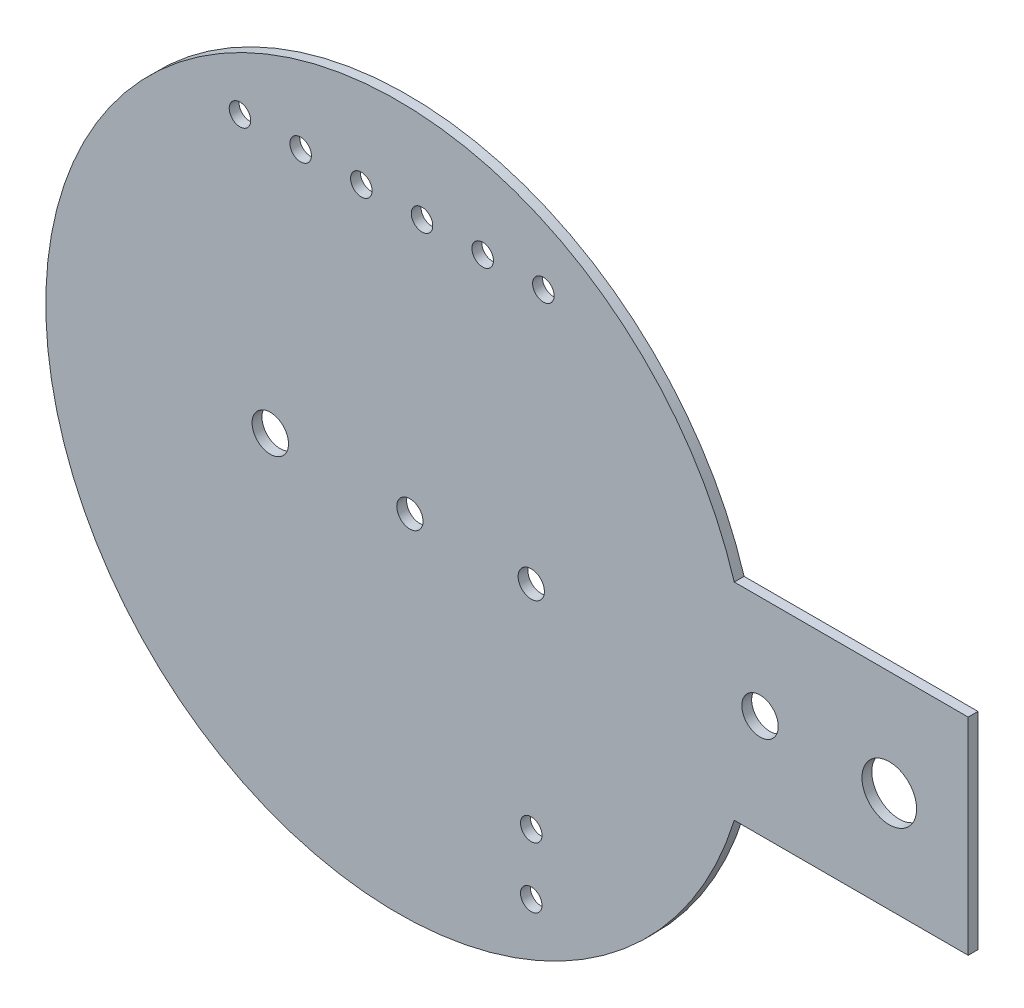
ISO-10303-21;
HEADER;
FILE_DESCRIPTION(('STEP AP214'),'2;1');
FILE_NAME('part.step','',(''),(''),'','','');
FILE_SCHEMA(('AUTOMOTIVE_DESIGN { 1 0 10303 214 1 1 1 1 }'));
ENDSEC;
DATA;
#1=APPLICATION_CONTEXT('core data for automotive mechanical design processes');
#2=APPLICATION_PROTOCOL_DEFINITION('international standard','automotive_design',2000,#1);
#3=PRODUCT_CONTEXT('',#1,'mechanical');
#4=PRODUCT('Part','Part','',(#3));
#5=PRODUCT_RELATED_PRODUCT_CATEGORY('part','',(#4));
#6=PRODUCT_DEFINITION_FORMATION('','',#4);
#7=PRODUCT_DEFINITION_CONTEXT('part definition',#1,'design');
#8=PRODUCT_DEFINITION('design','',#6,#7);
#9=PRODUCT_DEFINITION_SHAPE('','',#8);
#10=(LENGTH_UNIT() NAMED_UNIT(*) SI_UNIT(.MILLI.,.METRE.));
#11=(NAMED_UNIT(*) PLANE_ANGLE_UNIT() SI_UNIT($,.RADIAN.));
#12=(NAMED_UNIT(*) SI_UNIT($,.STERADIAN.) SOLID_ANGLE_UNIT());
#13=UNCERTAINTY_MEASURE_WITH_UNIT(LENGTH_MEASURE(1.E-05),#10,'distance_accuracy_value','');
#14=(GEOMETRIC_REPRESENTATION_CONTEXT(3) GLOBAL_UNCERTAINTY_ASSIGNED_CONTEXT((#13)) GLOBAL_UNIT_ASSIGNED_CONTEXT((#10,
#11,#12)) REPRESENTATION_CONTEXT('',''));
#15=CARTESIAN_POINT('',(0.,0.,0.));
#16=DIRECTION('',(0.,0.,1.));
#17=DIRECTION('',(1.,0.,0.));
#18=AXIS2_PLACEMENT_3D('',#15,#16,#17);
#19=CARTESIAN_POINT('',(28.816999435425,4.317999839783,0.));
#20=DIRECTION('',(0.,0.,1.));
#21=DIRECTION('',(1.,0.,0.));
#22=AXIS2_PLACEMENT_3D('',#19,#20,#21);
#23=PLANE('',#22);
#24=CARTESIAN_POINT('',(20.828,10.922,0.));
#25=DIRECTION('',(0.,0.,-1.));
#26=DIRECTION('',(-1.,0.,0.));
#27=AXIS2_PLACEMENT_3D('',#24,#25,#26);
#28=CIRCLE('',#27,0.4499991);
#29=CARTESIAN_POINT('',(20.3780009,10.922,0.));
#30=VERTEX_POINT('',#29);
#31=EDGE_CURVE('E126',#30,#30,#28,.T.);
#32=ORIENTED_EDGE('',*,*,#31,.T.);
#33=EDGE_LOOP('',(#32));
#34=FACE_BOUND('',#33,.T.);
#35=CARTESIAN_POINT('',(29.8958,0.,0.));
#36=DIRECTION('',(0.,0.,-1.));
#37=DIRECTION('',(-1.,0.,0.));
#38=AXIS2_PLACEMENT_3D('',#35,#36,#37);
#39=CIRCLE('',#38,0.762);
#40=CARTESIAN_POINT('',(29.1338,0.,0.));
#41=VERTEX_POINT('',#40);
#42=EDGE_CURVE('E129',#41,#41,#39,.T.);
#43=ORIENTED_EDGE('',*,*,#42,.T.);
#44=EDGE_LOOP('',(#43));
#45=FACE_BOUND('',#44,.T.);
#46=CARTESIAN_POINT('',(18.288,10.922,0.));
#47=DIRECTION('',(0.,0.,-1.));
#48=DIRECTION('',(-1.,0.,0.));
#49=AXIS2_PLACEMENT_3D('',#46,#47,#48);
#50=CIRCLE('',#49,0.4499991);
#51=CARTESIAN_POINT('',(17.8380009,10.922,0.));
#52=VERTEX_POINT('',#51);
#53=EDGE_CURVE('E132',#52,#52,#50,.T.);
#54=ORIENTED_EDGE('',*,*,#53,.T.);
#55=EDGE_LOOP('',(#54));
#56=FACE_BOUND('',#55,.T.);
#57=CARTESIAN_POINT('',(20.32,0.,0.));
#58=DIRECTION('',(0.,0.,-1.));
#59=DIRECTION('',(-1.,0.,0.));
#60=AXIS2_PLACEMENT_3D('',#57,#58,#59);
#61=CIRCLE('',#60,0.5499989);
#62=CARTESIAN_POINT('',(19.7700011,0.,0.));
#63=VERTEX_POINT('',#62);
#64=EDGE_CURVE('E135',#63,#63,#61,.T.);
#65=ORIENTED_EDGE('',*,*,#64,.T.);
#66=EDGE_LOOP('',(#65));
#67=FACE_BOUND('',#66,.T.);
#68=CARTESIAN_POINT('',(35.306,-0.09368028,0.));
#69=DIRECTION('',(0.,0.,-1.));
#70=DIRECTION('',(-1.,0.,0.));
#71=AXIS2_PLACEMENT_3D('',#68,#69,#70);
#72=CIRCLE('',#71,1.143);
#73=CARTESIAN_POINT('',(34.163,-0.09368028,0.));
#74=VERTEX_POINT('',#73);
#75=EDGE_CURVE('E138',#74,#74,#72,.T.);
#76=ORIENTED_EDGE('',*,*,#75,.T.);
#77=EDGE_LOOP('',(#76));
#78=FACE_BOUND('',#77,.T.);
#79=CARTESIAN_POINT('',(20.32,-8.89,0.));
#80=DIRECTION('',(0.,0.,-1.));
#81=DIRECTION('',(-1.,0.,0.));
#82=AXIS2_PLACEMENT_3D('',#79,#80,#81);
#83=CIRCLE('',#82,0.4499991);
#84=CARTESIAN_POINT('',(19.8700009,-8.89,0.));
#85=VERTEX_POINT('',#84);
#86=EDGE_CURVE('E141',#85,#85,#83,.T.);
#87=ORIENTED_EDGE('',*,*,#86,.T.);
#88=EDGE_LOOP('',(#87));
#89=FACE_BOUND('',#88,.T.);
#90=CARTESIAN_POINT('',(20.32,-11.43,0.));
#91=DIRECTION('',(0.,0.,-1.));
#92=DIRECTION('',(-1.,0.,0.));
#93=AXIS2_PLACEMENT_3D('',#90,#91,#92);
#94=CIRCLE('',#93,0.4499991);
#95=CARTESIAN_POINT('',(19.8700009,-11.43,0.));
#96=VERTEX_POINT('',#95);
#97=EDGE_CURVE('E144',#96,#96,#94,.T.);
#98=ORIENTED_EDGE('',*,*,#97,.T.);
#99=EDGE_LOOP('',(#98));
#100=FACE_BOUND('',#99,.T.);
#101=CARTESIAN_POINT('',(13.208,10.922,0.));
#102=DIRECTION('',(0.,0.,-1.));
#103=DIRECTION('',(-1.,0.,0.));
#104=AXIS2_PLACEMENT_3D('',#101,#102,#103);
#105=CIRCLE('',#104,0.4499991);
#106=CARTESIAN_POINT('',(12.7580009,10.922,0.));
#107=VERTEX_POINT('',#106);
#108=EDGE_CURVE('E147',#107,#107,#105,.T.);
#109=ORIENTED_EDGE('',*,*,#108,.T.);
#110=EDGE_LOOP('',(#109));
#111=FACE_BOUND('',#110,.T.);
#112=CARTESIAN_POINT('',(15.748,10.922,0.));
#113=DIRECTION('',(0.,0.,-1.));
#114=DIRECTION('',(-1.,0.,0.));
#115=AXIS2_PLACEMENT_3D('',#112,#113,#114);
#116=CIRCLE('',#115,0.4499991);
#117=CARTESIAN_POINT('',(15.2980009,10.922,0.));
#118=VERTEX_POINT('',#117);
#119=EDGE_CURVE('E150',#118,#118,#116,.T.);
#120=ORIENTED_EDGE('',*,*,#119,.T.);
#121=EDGE_LOOP('',(#120));
#122=FACE_BOUND('',#121,.T.);
#123=CARTESIAN_POINT('',(10.668,10.922,0.));
#124=DIRECTION('',(0.,0.,-1.));
#125=DIRECTION('',(-1.,0.,0.));
#126=AXIS2_PLACEMENT_3D('',#123,#124,#125);
#127=CIRCLE('',#126,0.4499991);
#128=CARTESIAN_POINT('',(10.2180009,10.922,0.));
#129=VERTEX_POINT('',#128);
#130=EDGE_CURVE('E153',#129,#129,#127,.T.);
#131=ORIENTED_EDGE('',*,*,#130,.T.);
#132=EDGE_LOOP('',(#131));
#133=FACE_BOUND('',#132,.T.);
#134=CARTESIAN_POINT('',(9.398,0.,0.));
#135=DIRECTION('',(0.,0.,-1.));
#136=DIRECTION('',(-1.,0.,0.));
#137=AXIS2_PLACEMENT_3D('',#134,#135,#136);
#138=CIRCLE('',#137,0.762);
#139=CARTESIAN_POINT('',(8.636,0.,0.));
#140=VERTEX_POINT('',#139);
#141=EDGE_CURVE('E156',#140,#140,#138,.T.);
#142=ORIENTED_EDGE('',*,*,#141,.T.);
#143=EDGE_LOOP('',(#142));
#144=FACE_BOUND('',#143,.T.);
#145=CARTESIAN_POINT('',(15.24,0.,0.));
#146=DIRECTION('',(0.,0.,-1.));
#147=DIRECTION('',(-1.,0.,0.));
#148=AXIS2_PLACEMENT_3D('',#145,#146,#147);
#149=CIRCLE('',#148,0.5499989);
#150=CARTESIAN_POINT('',(14.6900011,0.,0.));
#151=VERTEX_POINT('',#150);
#152=EDGE_CURVE('E159',#151,#151,#149,.T.);
#153=ORIENTED_EDGE('',*,*,#152,.T.);
#154=EDGE_LOOP('',(#153));
#155=FACE_BOUND('',#154,.T.);
#156=CARTESIAN_POINT('',(8.128,10.922,0.));
#157=DIRECTION('',(0.,0.,-1.));
#158=DIRECTION('',(-1.,0.,0.));
#159=AXIS2_PLACEMENT_3D('',#156,#157,#158);
#160=CIRCLE('',#159,0.4499991);
#161=CARTESIAN_POINT('',(7.6780009,10.922,0.));
#162=VERTEX_POINT('',#161);
#163=EDGE_CURVE('E161',#162,#162,#160,.T.);
#164=ORIENTED_EDGE('',*,*,#163,.T.);
#165=EDGE_LOOP('',(#164));
#166=FACE_BOUND('',#165,.T.);
#167=DIRECTION('',(0.,1.,0.));
#168=VECTOR('',#167,1.);
#169=CARTESIAN_POINT('',(38.608001708984,4.317999839783,0.));
#170=LINE('',#169,#168);
#171=CARTESIAN_POINT('',(38.608001708984,4.317999839783,0.));
#172=VERTEX_POINT('',#171);
#173=CARTESIAN_POINT('',(38.608001708984,-4.317999839783,0.));
#174=VERTEX_POINT('',#173);
#175=EDGE_CURVE('E73',#172,#174,#170,.F.);
#176=ORIENTED_EDGE('',*,*,#175,.F.);
#177=DIRECTION('',(1.,0.,0.));
#178=VECTOR('',#177,1.);
#179=CARTESIAN_POINT('',(28.816999435425,4.317999839783,0.));
#180=LINE('',#179,#178);
#181=CARTESIAN_POINT('',(28.8169994354248,4.317999839783,0.));
#182=VERTEX_POINT('',#181);
#183=EDGE_CURVE('E66',#182,#172,#180,.T.);
#184=ORIENTED_EDGE('',*,*,#183,.F.);
#185=CARTESIAN_POINT('',(14.732008791899,0.,0.));
#186=DIRECTION('',(0.,0.,-1.));
#187=DIRECTION('',(-1.,0.,0.));
#188=AXIS2_PLACEMENT_3D('',#185,#186,#187);
#189=CIRCLE('',#188,14.732008825838);
#190=CARTESIAN_POINT('',(28.8169994354248,-4.317999839783,0.));
#191=VERTEX_POINT('',#190);
#192=EDGE_CURVE('E18',#191,#182,#189,.T.);
#193=ORIENTED_EDGE('',*,*,#192,.F.);
#194=DIRECTION('',(1.,0.,0.));
#195=VECTOR('',#194,1.);
#196=CARTESIAN_POINT('',(38.608001708984,-4.317999839783,0.));
#197=LINE('',#196,#195);
#198=EDGE_CURVE('E53',#174,#191,#197,.F.);
#199=ORIENTED_EDGE('',*,*,#198,.F.);
#200=EDGE_LOOP('',(#176,#184,#193,#199));
#201=FACE_BOUND('',#200,.T.);
#202=ADVANCED_FACE('F15',(#34,#45,#56,#67,#78,#89,#100,#111,#122,#133,#144,#155,#166,#201),#23,.T.);
#203=CARTESIAN_POINT('',(14.732008791899,0.,-0.41148));
#204=DIRECTION('',(0.,0.,-1.));
#205=DIRECTION('',(-1.,0.,0.));
#206=AXIS2_PLACEMENT_3D('',#203,#204,#205);
#207=CYLINDRICAL_SURFACE('',#206,14.732008825838);
#208=DIRECTION('',(0.,0.,1.));
#209=VECTOR('',#208,1.);
#210=CARTESIAN_POINT('',(28.816999435425,4.317999839783,-0.41148));
#211=LINE('',#210,#209);
#212=CARTESIAN_POINT('',(28.8169994354248,4.317999839783,-0.41148));
#213=VERTEX_POINT('',#212);
#214=EDGE_CURVE('E83',#213,#182,#211,.T.);
#215=ORIENTED_EDGE('',*,*,#214,.F.);
#216=CARTESIAN_POINT('',(14.732008791899,0.,-0.41148));
#217=DIRECTION('',(0.,0.,-1.));
#218=DIRECTION('',(-1.,0.,0.));
#219=AXIS2_PLACEMENT_3D('',#216,#217,#218);
#220=CIRCLE('',#219,14.732008825838);
#221=CARTESIAN_POINT('',(28.8169994354248,-4.317999839783,-0.41148));
#222=VERTEX_POINT('',#221);
#223=EDGE_CURVE('E72',#213,#222,#220,.F.);
#224=ORIENTED_EDGE('',*,*,#223,.T.);
#225=DIRECTION('',(0.,0.,-1.));
#226=VECTOR('',#225,1.);
#227=CARTESIAN_POINT('',(28.816999435425,-4.317999839783,-0.41148));
#228=LINE('',#227,#226);
#229=EDGE_CURVE('E58',#191,#222,#228,.T.);
#230=ORIENTED_EDGE('',*,*,#229,.F.);
#231=ORIENTED_EDGE('',*,*,#192,.T.);
#232=EDGE_LOOP('',(#215,#224,#230,#231));
#233=FACE_BOUND('',#232,.T.);
#234=ADVANCED_FACE('F71',(#233),#207,.T.);
#235=CARTESIAN_POINT('',(38.608001708984,-4.317999839783,-0.41148));
#236=DIRECTION('',(0.,-1.,0.));
#237=DIRECTION('',(0.,0.,-1.));
#238=AXIS2_PLACEMENT_3D('',#235,#236,#237);
#239=PLANE('',#238);
#240=ORIENTED_EDGE('',*,*,#229,.T.);
#241=DIRECTION('',(1.,0.,0.));
#242=VECTOR('',#241,1.);
#243=CARTESIAN_POINT('',(28.816999435425,-4.317999839783,-0.41148));
#244=LINE('',#243,#242);
#245=CARTESIAN_POINT('',(38.608001708984,-4.317999839783,-0.41148));
#246=VERTEX_POINT('',#245);
#247=EDGE_CURVE('E125',#222,#246,#244,.T.);
#248=ORIENTED_EDGE('',*,*,#247,.T.);
#249=DIRECTION('',(0.,0.,-1.));
#250=VECTOR('',#249,1.);
#251=CARTESIAN_POINT('',(38.608001708984,-4.317999839783,-0.41148));
#252=LINE('',#251,#250);
#253=EDGE_CURVE('E60',#174,#246,#252,.T.);
#254=ORIENTED_EDGE('',*,*,#253,.F.);
#255=ORIENTED_EDGE('',*,*,#198,.T.);
#256=EDGE_LOOP('',(#240,#248,#254,#255));
#257=FACE_BOUND('',#256,.T.);
#258=ADVANCED_FACE('F55',(#257),#239,.T.);
#259=CARTESIAN_POINT('',(38.608001708984,4.317999839783,-0.41148));
#260=DIRECTION('',(1.,0.,0.));
#261=DIRECTION('',(0.,0.,-1.));
#262=AXIS2_PLACEMENT_3D('',#259,#260,#261);
#263=PLANE('',#262);
#264=ORIENTED_EDGE('',*,*,#253,.T.);
#265=DIRECTION('',(0.,1.,0.));
#266=VECTOR('',#265,1.);
#267=CARTESIAN_POINT('',(38.608001708984,4.317999839783,-0.41148));
#268=LINE('',#267,#266);
#269=CARTESIAN_POINT('',(38.608001708984,4.317999839783,-0.41148));
#270=VERTEX_POINT('',#269);
#271=EDGE_CURVE('E171',#246,#270,#268,.T.);
#272=ORIENTED_EDGE('',*,*,#271,.T.);
#273=DIRECTION('',(0.,0.,1.));
#274=VECTOR('',#273,1.);
#275=CARTESIAN_POINT('',(38.608001708984,4.317999839783,-0.41148));
#276=LINE('',#275,#274);
#277=EDGE_CURVE('E33',#172,#270,#276,.F.);
#278=ORIENTED_EDGE('',*,*,#277,.F.);
#279=ORIENTED_EDGE('',*,*,#175,.T.);
#280=EDGE_LOOP('',(#264,#272,#278,#279));
#281=FACE_BOUND('',#280,.T.);
#282=ADVANCED_FACE('F185',(#281),#263,.T.);
#283=CARTESIAN_POINT('',(28.816999435425,4.317999839783,-0.41148));
#284=DIRECTION('',(0.,1.,0.));
#285=DIRECTION('',(0.,0.,1.));
#286=AXIS2_PLACEMENT_3D('',#283,#284,#285);
#287=PLANE('',#286);
#288=ORIENTED_EDGE('',*,*,#277,.T.);
#289=DIRECTION('',(1.,0.,0.));
#290=VECTOR('',#289,1.);
#291=CARTESIAN_POINT('',(28.816999435425,4.317999839783,-0.41148));
#292=LINE('',#291,#290);
#293=EDGE_CURVE('E123',#270,#213,#292,.F.);
#294=ORIENTED_EDGE('',*,*,#293,.T.);
#295=ORIENTED_EDGE('',*,*,#214,.T.);
#296=ORIENTED_EDGE('',*,*,#183,.T.);
#297=EDGE_LOOP('',(#288,#294,#295,#296));
#298=FACE_BOUND('',#297,.T.);
#299=ADVANCED_FACE('F177',(#298),#287,.T.);
#300=CARTESIAN_POINT('',(8.128,10.922,-0.41148));
#301=DIRECTION('',(0.,0.,-1.));
#302=DIRECTION('',(-1.,0.,0.));
#303=AXIS2_PLACEMENT_3D('',#300,#301,#302);
#304=CYLINDRICAL_SURFACE('',#303,0.4499991);
#305=ORIENTED_EDGE('',*,*,#163,.F.);
#306=EDGE_LOOP('',(#305));
#307=FACE_BOUND('',#306,.T.);
#308=CARTESIAN_POINT('',(8.128,10.922,-0.41148));
#309=DIRECTION('',(0.,0.,-1.));
#310=DIRECTION('',(-1.,0.,0.));
#311=AXIS2_PLACEMENT_3D('',#308,#309,#310);
#312=CIRCLE('',#311,0.4499991);
#313=CARTESIAN_POINT('',(7.6780009,10.922,-0.41148));
#314=VERTEX_POINT('',#313);
#315=EDGE_CURVE('E120',#314,#314,#312,.T.);
#316=ORIENTED_EDGE('',*,*,#315,.T.);
#317=EDGE_LOOP('',(#316));
#318=FACE_BOUND('',#317,.T.);
#319=ADVANCED_FACE('F193',(#307,#318),#304,.F.);
#320=CARTESIAN_POINT('',(15.24,0.,-0.41148));
#321=DIRECTION('',(0.,0.,-1.));
#322=DIRECTION('',(-1.,0.,0.));
#323=AXIS2_PLACEMENT_3D('',#320,#321,#322);
#324=CYLINDRICAL_SURFACE('',#323,0.5499989);
#325=ORIENTED_EDGE('',*,*,#152,.F.);
#326=EDGE_LOOP('',(#325));
#327=FACE_BOUND('',#326,.T.);
#328=CARTESIAN_POINT('',(15.24,0.,-0.41148));
#329=DIRECTION('',(0.,0.,-1.));
#330=DIRECTION('',(-1.,0.,0.));
#331=AXIS2_PLACEMENT_3D('',#328,#329,#330);
#332=CIRCLE('',#331,0.5499989);
#333=CARTESIAN_POINT('',(14.6900011,0.,-0.41148));
#334=VERTEX_POINT('',#333);
#335=EDGE_CURVE('E117',#334,#334,#332,.T.);
#336=ORIENTED_EDGE('',*,*,#335,.T.);
#337=EDGE_LOOP('',(#336));
#338=FACE_BOUND('',#337,.T.);
#339=ADVANCED_FACE('F247',(#327,#338),#324,.F.);
#340=CARTESIAN_POINT('',(9.398,0.,-0.41148));
#341=DIRECTION('',(0.,0.,-1.));
#342=DIRECTION('',(-1.,0.,0.));
#343=AXIS2_PLACEMENT_3D('',#340,#341,#342);
#344=CYLINDRICAL_SURFACE('',#343,0.762);
#345=ORIENTED_EDGE('',*,*,#141,.F.);
#346=EDGE_LOOP('',(#345));
#347=FACE_BOUND('',#346,.T.);
#348=CARTESIAN_POINT('',(9.398,0.,-0.41148));
#349=DIRECTION('',(0.,0.,-1.));
#350=DIRECTION('',(-1.,0.,0.));
#351=AXIS2_PLACEMENT_3D('',#348,#349,#350);
#352=CIRCLE('',#351,0.762);
#353=CARTESIAN_POINT('',(8.636,0.,-0.41148));
#354=VERTEX_POINT('',#353);
#355=EDGE_CURVE('E114',#354,#354,#352,.T.);
#356=ORIENTED_EDGE('',*,*,#355,.T.);
#357=EDGE_LOOP('',(#356));
#358=FACE_BOUND('',#357,.T.);
#359=ADVANCED_FACE('F243',(#347,#358),#344,.F.);
#360=CARTESIAN_POINT('',(10.668,10.922,-0.41148));
#361=DIRECTION('',(0.,0.,-1.));
#362=DIRECTION('',(-1.,0.,0.));
#363=AXIS2_PLACEMENT_3D('',#360,#361,#362);
#364=CYLINDRICAL_SURFACE('',#363,0.4499991);
#365=ORIENTED_EDGE('',*,*,#130,.F.);
#366=EDGE_LOOP('',(#365));
#367=FACE_BOUND('',#366,.T.);
#368=CARTESIAN_POINT('',(10.668,10.922,-0.41148));
#369=DIRECTION('',(0.,0.,-1.));
#370=DIRECTION('',(-1.,0.,0.));
#371=AXIS2_PLACEMENT_3D('',#368,#369,#370);
#372=CIRCLE('',#371,0.4499991);
#373=CARTESIAN_POINT('',(10.2180009,10.922,-0.41148));
#374=VERTEX_POINT('',#373);
#375=EDGE_CURVE('E111',#374,#374,#372,.T.);
#376=ORIENTED_EDGE('',*,*,#375,.T.);
#377=EDGE_LOOP('',(#376));
#378=FACE_BOUND('',#377,.T.);
#379=ADVANCED_FACE('F239',(#367,#378),#364,.F.);
#380=CARTESIAN_POINT('',(15.748,10.922,-0.41148));
#381=DIRECTION('',(0.,0.,-1.));
#382=DIRECTION('',(-1.,0.,0.));
#383=AXIS2_PLACEMENT_3D('',#380,#381,#382);
#384=CYLINDRICAL_SURFACE('',#383,0.4499991);
#385=ORIENTED_EDGE('',*,*,#119,.F.);
#386=EDGE_LOOP('',(#385));
#387=FACE_BOUND('',#386,.T.);
#388=CARTESIAN_POINT('',(15.748,10.922,-0.41148));
#389=DIRECTION('',(0.,0.,-1.));
#390=DIRECTION('',(-1.,0.,0.));
#391=AXIS2_PLACEMENT_3D('',#388,#389,#390);
#392=CIRCLE('',#391,0.4499991);
#393=CARTESIAN_POINT('',(15.2980009,10.922,-0.41148));
#394=VERTEX_POINT('',#393);
#395=EDGE_CURVE('E108',#394,#394,#392,.T.);
#396=ORIENTED_EDGE('',*,*,#395,.T.);
#397=EDGE_LOOP('',(#396));
#398=FACE_BOUND('',#397,.T.);
#399=ADVANCED_FACE('F235',(#387,#398),#384,.F.);
#400=CARTESIAN_POINT('',(13.208,10.922,-0.41148));
#401=DIRECTION('',(0.,0.,-1.));
#402=DIRECTION('',(-1.,0.,0.));
#403=AXIS2_PLACEMENT_3D('',#400,#401,#402);
#404=CYLINDRICAL_SURFACE('',#403,0.4499991);
#405=ORIENTED_EDGE('',*,*,#108,.F.);
#406=EDGE_LOOP('',(#405));
#407=FACE_BOUND('',#406,.T.);
#408=CARTESIAN_POINT('',(13.208,10.922,-0.41148));
#409=DIRECTION('',(0.,0.,-1.));
#410=DIRECTION('',(-1.,0.,0.));
#411=AXIS2_PLACEMENT_3D('',#408,#409,#410);
#412=CIRCLE('',#411,0.4499991);
#413=CARTESIAN_POINT('',(12.7580009,10.922,-0.41148));
#414=VERTEX_POINT('',#413);
#415=EDGE_CURVE('E105',#414,#414,#412,.T.);
#416=ORIENTED_EDGE('',*,*,#415,.T.);
#417=EDGE_LOOP('',(#416));
#418=FACE_BOUND('',#417,.T.);
#419=ADVANCED_FACE('F231',(#407,#418),#404,.F.);
#420=CARTESIAN_POINT('',(20.32,-11.43,-0.41148));
#421=DIRECTION('',(0.,0.,-1.));
#422=DIRECTION('',(-1.,0.,0.));
#423=AXIS2_PLACEMENT_3D('',#420,#421,#422);
#424=CYLINDRICAL_SURFACE('',#423,0.4499991);
#425=ORIENTED_EDGE('',*,*,#97,.F.);
#426=EDGE_LOOP('',(#425));
#427=FACE_BOUND('',#426,.T.);
#428=CARTESIAN_POINT('',(20.32,-11.43,-0.41148));
#429=DIRECTION('',(0.,0.,-1.));
#430=DIRECTION('',(-1.,0.,0.));
#431=AXIS2_PLACEMENT_3D('',#428,#429,#430);
#432=CIRCLE('',#431,0.4499991);
#433=CARTESIAN_POINT('',(19.8700009,-11.43,-0.41148));
#434=VERTEX_POINT('',#433);
#435=EDGE_CURVE('E102',#434,#434,#432,.T.);
#436=ORIENTED_EDGE('',*,*,#435,.T.);
#437=EDGE_LOOP('',(#436));
#438=FACE_BOUND('',#437,.T.);
#439=ADVANCED_FACE('F227',(#427,#438),#424,.F.);
#440=CARTESIAN_POINT('',(20.32,-8.89,-0.41148));
#441=DIRECTION('',(0.,0.,-1.));
#442=DIRECTION('',(-1.,0.,0.));
#443=AXIS2_PLACEMENT_3D('',#440,#441,#442);
#444=CYLINDRICAL_SURFACE('',#443,0.4499991);
#445=ORIENTED_EDGE('',*,*,#86,.F.);
#446=EDGE_LOOP('',(#445));
#447=FACE_BOUND('',#446,.T.);
#448=CARTESIAN_POINT('',(20.32,-8.89,-0.41148));
#449=DIRECTION('',(0.,0.,-1.));
#450=DIRECTION('',(-1.,0.,0.));
#451=AXIS2_PLACEMENT_3D('',#448,#449,#450);
#452=CIRCLE('',#451,0.4499991);
#453=CARTESIAN_POINT('',(19.8700009,-8.89,-0.41148));
#454=VERTEX_POINT('',#453);
#455=EDGE_CURVE('E99',#454,#454,#452,.T.);
#456=ORIENTED_EDGE('',*,*,#455,.T.);
#457=EDGE_LOOP('',(#456));
#458=FACE_BOUND('',#457,.T.);
#459=ADVANCED_FACE('F223',(#447,#458),#444,.F.);
#460=CARTESIAN_POINT('',(35.306,-0.09368028,-0.41148));
#461=DIRECTION('',(0.,0.,-1.));
#462=DIRECTION('',(-1.,0.,0.));
#463=AXIS2_PLACEMENT_3D('',#460,#461,#462);
#464=CYLINDRICAL_SURFACE('',#463,1.143);
#465=ORIENTED_EDGE('',*,*,#75,.F.);
#466=EDGE_LOOP('',(#465));
#467=FACE_BOUND('',#466,.T.);
#468=CARTESIAN_POINT('',(35.306,-0.09368028,-0.41148));
#469=DIRECTION('',(0.,0.,-1.));
#470=DIRECTION('',(-1.,0.,0.));
#471=AXIS2_PLACEMENT_3D('',#468,#469,#470);
#472=CIRCLE('',#471,1.143);
#473=CARTESIAN_POINT('',(34.163,-0.09368028,-0.41148));
#474=VERTEX_POINT('',#473);
#475=EDGE_CURVE('E96',#474,#474,#472,.T.);
#476=ORIENTED_EDGE('',*,*,#475,.T.);
#477=EDGE_LOOP('',(#476));
#478=FACE_BOUND('',#477,.T.);
#479=ADVANCED_FACE('F219',(#467,#478),#464,.F.);
#480=CARTESIAN_POINT('',(20.32,0.,-0.41148));
#481=DIRECTION('',(0.,0.,-1.));
#482=DIRECTION('',(-1.,0.,0.));
#483=AXIS2_PLACEMENT_3D('',#480,#481,#482);
#484=CYLINDRICAL_SURFACE('',#483,0.5499989);
#485=ORIENTED_EDGE('',*,*,#64,.F.);
#486=EDGE_LOOP('',(#485));
#487=FACE_BOUND('',#486,.T.);
#488=CARTESIAN_POINT('',(20.32,0.,-0.41148));
#489=DIRECTION('',(0.,0.,-1.));
#490=DIRECTION('',(-1.,0.,0.));
#491=AXIS2_PLACEMENT_3D('',#488,#489,#490);
#492=CIRCLE('',#491,0.5499989);
#493=CARTESIAN_POINT('',(19.7700011,0.,-0.41148));
#494=VERTEX_POINT('',#493);
#495=EDGE_CURVE('E93',#494,#494,#492,.T.);
#496=ORIENTED_EDGE('',*,*,#495,.T.);
#497=EDGE_LOOP('',(#496));
#498=FACE_BOUND('',#497,.T.);
#499=ADVANCED_FACE('F215',(#487,#498),#484,.F.);
#500=CARTESIAN_POINT('',(18.288,10.922,-0.41148));
#501=DIRECTION('',(0.,0.,-1.));
#502=DIRECTION('',(-1.,0.,0.));
#503=AXIS2_PLACEMENT_3D('',#500,#501,#502);
#504=CYLINDRICAL_SURFACE('',#503,0.4499991);
#505=ORIENTED_EDGE('',*,*,#53,.F.);
#506=EDGE_LOOP('',(#505));
#507=FACE_BOUND('',#506,.T.);
#508=CARTESIAN_POINT('',(18.288,10.922,-0.41148));
#509=DIRECTION('',(0.,0.,-1.));
#510=DIRECTION('',(-1.,0.,0.));
#511=AXIS2_PLACEMENT_3D('',#508,#509,#510);
#512=CIRCLE('',#511,0.4499991);
#513=CARTESIAN_POINT('',(17.8380009,10.922,-0.41148));
#514=VERTEX_POINT('',#513);
#515=EDGE_CURVE('E90',#514,#514,#512,.T.);
#516=ORIENTED_EDGE('',*,*,#515,.T.);
#517=EDGE_LOOP('',(#516));
#518=FACE_BOUND('',#517,.T.);
#519=ADVANCED_FACE('F211',(#507,#518),#504,.F.);
#520=CARTESIAN_POINT('',(29.8958,0.,-0.41148));
#521=DIRECTION('',(0.,0.,-1.));
#522=DIRECTION('',(-1.,0.,0.));
#523=AXIS2_PLACEMENT_3D('',#520,#521,#522);
#524=CYLINDRICAL_SURFACE('',#523,0.762);
#525=ORIENTED_EDGE('',*,*,#42,.F.);
#526=EDGE_LOOP('',(#525));
#527=FACE_BOUND('',#526,.T.);
#528=CARTESIAN_POINT('',(29.8958,0.,-0.41148));
#529=DIRECTION('',(0.,0.,-1.));
#530=DIRECTION('',(-1.,0.,0.));
#531=AXIS2_PLACEMENT_3D('',#528,#529,#530);
#532=CIRCLE('',#531,0.762);
#533=CARTESIAN_POINT('',(29.1338,0.,-0.41148));
#534=VERTEX_POINT('',#533);
#535=EDGE_CURVE('E24',#534,#534,#532,.T.);
#536=ORIENTED_EDGE('',*,*,#535,.T.);
#537=EDGE_LOOP('',(#536));
#538=FACE_BOUND('',#537,.T.);
#539=ADVANCED_FACE('F203',(#527,#538),#524,.F.);
#540=CARTESIAN_POINT('',(20.828,10.922,-0.41148));
#541=DIRECTION('',(0.,0.,-1.));
#542=DIRECTION('',(-1.,0.,0.));
#543=AXIS2_PLACEMENT_3D('',#540,#541,#542);
#544=CYLINDRICAL_SURFACE('',#543,0.4499991);
#545=ORIENTED_EDGE('',*,*,#31,.F.);
#546=EDGE_LOOP('',(#545));
#547=FACE_BOUND('',#546,.T.);
#548=CARTESIAN_POINT('',(20.828,10.922,-0.41148));
#549=DIRECTION('',(0.,0.,-1.));
#550=DIRECTION('',(-1.,0.,0.));
#551=AXIS2_PLACEMENT_3D('',#548,#549,#550);
#552=CIRCLE('',#551,0.4499991);
#553=CARTESIAN_POINT('',(20.3780009,10.922,-0.41148));
#554=VERTEX_POINT('',#553);
#555=EDGE_CURVE('E10',#554,#554,#552,.T.);
#556=ORIENTED_EDGE('',*,*,#555,.T.);
#557=EDGE_LOOP('',(#556));
#558=FACE_BOUND('',#557,.T.);
#559=ADVANCED_FACE('F197',(#547,#558),#544,.F.);
#560=CARTESIAN_POINT('',(28.816999435425,4.317999839783,-0.41148));
#561=DIRECTION('',(0.,0.,1.));
#562=DIRECTION('',(1.,0.,0.));
#563=AXIS2_PLACEMENT_3D('',#560,#561,#562);
#564=PLANE('',#563);
#565=ORIENTED_EDGE('',*,*,#555,.F.);
#566=EDGE_LOOP('',(#565));
#567=FACE_BOUND('',#566,.T.);
#568=ORIENTED_EDGE('',*,*,#535,.F.);
#569=EDGE_LOOP('',(#568));
#570=FACE_BOUND('',#569,.T.);
#571=ORIENTED_EDGE('',*,*,#515,.F.);
#572=EDGE_LOOP('',(#571));
#573=FACE_BOUND('',#572,.T.);
#574=ORIENTED_EDGE('',*,*,#495,.F.);
#575=EDGE_LOOP('',(#574));
#576=FACE_BOUND('',#575,.T.);
#577=ORIENTED_EDGE('',*,*,#475,.F.);
#578=EDGE_LOOP('',(#577));
#579=FACE_BOUND('',#578,.T.);
#580=ORIENTED_EDGE('',*,*,#455,.F.);
#581=EDGE_LOOP('',(#580));
#582=FACE_BOUND('',#581,.T.);
#583=ORIENTED_EDGE('',*,*,#435,.F.);
#584=EDGE_LOOP('',(#583));
#585=FACE_BOUND('',#584,.T.);
#586=ORIENTED_EDGE('',*,*,#415,.F.);
#587=EDGE_LOOP('',(#586));
#588=FACE_BOUND('',#587,.T.);
#589=ORIENTED_EDGE('',*,*,#395,.F.);
#590=EDGE_LOOP('',(#589));
#591=FACE_BOUND('',#590,.T.);
#592=ORIENTED_EDGE('',*,*,#375,.F.);
#593=EDGE_LOOP('',(#592));
#594=FACE_BOUND('',#593,.T.);
#595=ORIENTED_EDGE('',*,*,#355,.F.);
#596=EDGE_LOOP('',(#595));
#597=FACE_BOUND('',#596,.T.);
#598=ORIENTED_EDGE('',*,*,#335,.F.);
#599=EDGE_LOOP('',(#598));
#600=FACE_BOUND('',#599,.T.);
#601=ORIENTED_EDGE('',*,*,#315,.F.);
#602=EDGE_LOOP('',(#601));
#603=FACE_BOUND('',#602,.T.);
#604=ORIENTED_EDGE('',*,*,#271,.F.);
#605=ORIENTED_EDGE('',*,*,#247,.F.);
#606=ORIENTED_EDGE('',*,*,#223,.F.);
#607=ORIENTED_EDGE('',*,*,#293,.F.);
#608=EDGE_LOOP('',(#604,#605,#606,#607));
#609=FACE_BOUND('',#608,.T.);
#610=ADVANCED_FACE('F184',(#567,#570,#573,#576,#579,#582,#585,#588,#591,#594,#597,#600,#603,
#609),#564,.F.);
#611=CLOSED_SHELL('',(#202,#234,#258,#282,#299,#319,#339,#359,#379,#399,#419,#439,#459,#479,
#499,#519,#539,#559,#610));
#612=MANIFOLD_SOLID_BREP('B1',#611);
#613=ADVANCED_BREP_SHAPE_REPRESENTATION('',(#18,#612),#14);
#614=SHAPE_DEFINITION_REPRESENTATION(#9,#613);
ENDSEC;
END-ISO-10303-21;
